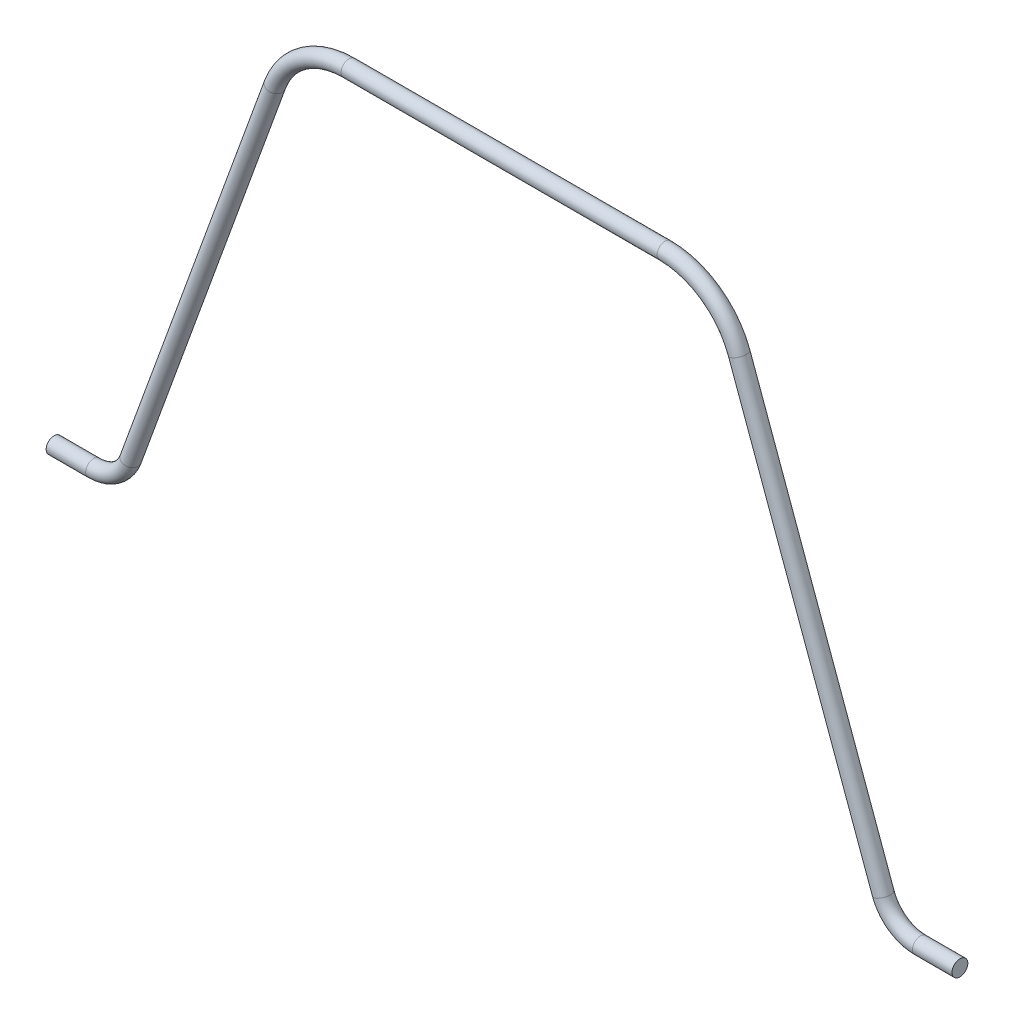
ISO-10303-21;
HEADER;
FILE_DESCRIPTION(('STEP AP214'),'2;1');
FILE_NAME('part.step','',(''),(''),'','','');
FILE_SCHEMA(('AUTOMOTIVE_DESIGN { 1 0 10303 214 1 1 1 1 }'));
ENDSEC;
DATA;
#1=APPLICATION_CONTEXT('core data for automotive mechanical design processes');
#2=APPLICATION_PROTOCOL_DEFINITION('international standard','automotive_design',2000,#1);
#3=PRODUCT_CONTEXT('',#1,'mechanical');
#4=PRODUCT('Part','Part','',(#3));
#5=PRODUCT_RELATED_PRODUCT_CATEGORY('part','',(#4));
#6=PRODUCT_DEFINITION_FORMATION('','',#4);
#7=PRODUCT_DEFINITION_CONTEXT('part definition',#1,'design');
#8=PRODUCT_DEFINITION('design','',#6,#7);
#9=PRODUCT_DEFINITION_SHAPE('','',#8);
#10=(LENGTH_UNIT() NAMED_UNIT(*) SI_UNIT(.MILLI.,.METRE.));
#11=(NAMED_UNIT(*) PLANE_ANGLE_UNIT() SI_UNIT($,.RADIAN.));
#12=(NAMED_UNIT(*) SI_UNIT($,.STERADIAN.) SOLID_ANGLE_UNIT());
#13=UNCERTAINTY_MEASURE_WITH_UNIT(LENGTH_MEASURE(1.E-05),#10,'distance_accuracy_value','');
#14=(GEOMETRIC_REPRESENTATION_CONTEXT(3) GLOBAL_UNCERTAINTY_ASSIGNED_CONTEXT((#13)) GLOBAL_UNIT_ASSIGNED_CONTEXT((#10,
#11,#12)) REPRESENTATION_CONTEXT('',''));
#15=CARTESIAN_POINT('',(0.,0.,0.));
#16=DIRECTION('',(0.,0.,1.));
#17=DIRECTION('',(1.,0.,0.));
#18=AXIS2_PLACEMENT_3D('',#15,#16,#17);
#19=CARTESIAN_POINT('',(-145.646970907959,-152.4,0.));
#20=DIRECTION('',(1.,0.,0.));
#21=DIRECTION('',(0.,0.,-1.));
#22=AXIS2_PLACEMENT_3D('',#19,#20,#21);
#23=PLANE('',#22);
#24=CARTESIAN_POINT('',(-145.646970907959,-152.4,0.));
#25=DIRECTION('',(1.,0.,0.));
#26=DIRECTION('',(0.,0.,-1.));
#27=AXIS2_PLACEMENT_3D('',#24,#25,#26);
#28=CIRCLE('',#27,2.54);
#29=CARTESIAN_POINT('',(-145.646970907959,-152.4,-2.54));
#30=VERTEX_POINT('',#29);
#31=EDGE_CURVE('E64',#30,#30,#28,.T.);
#32=ORIENTED_EDGE('',*,*,#31,.F.);
#33=EDGE_LOOP('',(#32));
#34=FACE_BOUND('',#33,.T.);
#35=ADVANCED_FACE('F30',(#34),#23,.F.);
#36=CARTESIAN_POINT('',(145.646970907959,-152.4,0.));
#37=DIRECTION('',(1.,0.,0.));
#38=DIRECTION('',(0.,0.,-1.));
#39=AXIS2_PLACEMENT_3D('',#36,#37,#38);
#40=PLANE('',#39);
#41=CARTESIAN_POINT('',(145.646970907959,-152.4,0.));
#42=DIRECTION('',(1.,0.,0.));
#43=DIRECTION('',(0.,0.,-1.));
#44=AXIS2_PLACEMENT_3D('',#41,#42,#43);
#45=CIRCLE('',#44,2.54);
#46=CARTESIAN_POINT('',(145.646970907959,-152.4,-2.54));
#47=VERTEX_POINT('',#46);
#48=EDGE_CURVE('E10',#47,#47,#45,.T.);
#49=ORIENTED_EDGE('',*,*,#48,.T.);
#50=EDGE_LOOP('',(#49));
#51=FACE_BOUND('',#50,.T.);
#52=ADVANCED_FACE('F71',(#51),#40,.T.);
#53=CARTESIAN_POINT('',(-145.646970907959,-152.4,0.));
#54=DIRECTION('',(1.,0.,0.));
#55=DIRECTION('',(0.,1.,0.));
#56=AXIS2_PLACEMENT_3D('',#53,#54,#55);
#57=CYLINDRICAL_SURFACE('',#56,2.54);
#58=CARTESIAN_POINT('',(-132.946970907959,-152.4,0.));
#59=DIRECTION('',(1.,0.,0.));
#60=DIRECTION('',(0.,0.,-1.));
#61=AXIS2_PLACEMENT_3D('',#58,#59,#60);
#62=CIRCLE('',#61,2.54);
#63=CARTESIAN_POINT('',(-132.946970907959,-154.94,0.));
#64=VERTEX_POINT('',#63);
#65=EDGE_CURVE('E61',#64,#64,#62,.T.);
#66=ORIENTED_EDGE('',*,*,#65,.F.);
#67=EDGE_LOOP('',(#66));
#68=FACE_BOUND('',#67,.T.);
#69=ORIENTED_EDGE('',*,*,#31,.T.);
#70=EDGE_LOOP('',(#69));
#71=FACE_BOUND('',#70,.T.);
#72=ADVANCED_FACE('F68',(#68,#71),#57,.T.);
#73=CARTESIAN_POINT('',(-132.946970907959,-139.7,0.));
#74=DIRECTION('',(0.,0.,1.));
#75=DIRECTION('',(1.,0.,0.));
#76=AXIS2_PLACEMENT_3D('',#73,#74,#75);
#77=TOROIDAL_SURFACE('',#76,12.7,2.54);
#78=CARTESIAN_POINT('',(-121.012874623978,-144.043655820236,0.));
#79=DIRECTION('',(0.342020143325666,0.939692620785909,0.));
#80=DIRECTION('',(0.,0.,-1.));
#81=AXIS2_PLACEMENT_3D('',#78,#79,#80);
#82=CIRCLE('',#81,2.54);
#83=CARTESIAN_POINT('',(-118.626055367182,-144.912386984283,0.));
#84=VERTEX_POINT('',#83);
#85=EDGE_CURVE('E58',#84,#84,#82,.T.);
#86=CARTESIAN_POINT('',(-132.946970907959,-139.7,0.));
#87=DIRECTION('',(0.,0.,1.));
#88=DIRECTION('',(1.,0.,0.));
#89=AXIS2_PLACEMENT_3D('',#86,#87,#88);
#90=CIRCLE('',#89,15.24);
#91=EDGE_CURVE('',#64,#84,#90,.T.);
#92=ORIENTED_EDGE('',*,*,#65,.T.);
#93=ORIENTED_EDGE('',*,*,#85,.F.);
#94=ORIENTED_EDGE('',*,*,#91,.T.);
#95=ORIENTED_EDGE('',*,*,#91,.F.);
#96=EDGE_LOOP('',(#92,#94,#93,#95));
#97=FACE_BOUND('',#96,.T.);
#98=ADVANCED_FACE('F105',(#97),#77,.T.);
#99=CARTESIAN_POINT('',(-121.012874623978,-144.043655820236,0.));
#100=DIRECTION('',(0.342020143325666,0.939692620785909,0.));
#101=DIRECTION('',(-0.939692620785909,0.342020143325666,0.));
#102=AXIS2_PLACEMENT_3D('',#99,#100,#101);
#103=CYLINDRICAL_SURFACE('',#102,2.54);
#104=CARTESIAN_POINT('',(-74.6681925679621,-16.7126883595281,0.));
#105=DIRECTION('',(0.342020143325666,0.939692620785909,0.));
#106=DIRECTION('',(0.,0.,-1.));
#107=AXIS2_PLACEMENT_3D('',#104,#105,#106);
#108=CIRCLE('',#107,2.54);
#109=CARTESIAN_POINT('',(-77.0550118247583,-15.8439571954809,0.));
#110=VERTEX_POINT('',#109);
#111=EDGE_CURVE('E55',#110,#110,#108,.T.);
#112=ORIENTED_EDGE('',*,*,#111,.F.);
#113=EDGE_LOOP('',(#112));
#114=FACE_BOUND('',#113,.T.);
#115=ORIENTED_EDGE('',*,*,#85,.T.);
#116=EDGE_LOOP('',(#115));
#117=FACE_BOUND('',#116,.T.);
#118=ADVANCED_FACE('F101',(#114,#117),#103,.T.);
#119=CARTESIAN_POINT('',(-50.8,-25.4,0.));
#120=DIRECTION('',(0.,0.,-1.));
#121=DIRECTION('',(-1.,0.,0.));
#122=AXIS2_PLACEMENT_3D('',#119,#120,#121);
#123=TOROIDAL_SURFACE('',#122,25.4,2.54);
#124=CARTESIAN_POINT('',(-50.8,0.,0.));
#125=DIRECTION('',(1.,0.,0.));
#126=DIRECTION('',(0.,0.,-1.));
#127=AXIS2_PLACEMENT_3D('',#124,#125,#126);
#128=CIRCLE('',#127,2.54);
#129=CARTESIAN_POINT('',(-50.8,2.54000000000001,0.));
#130=VERTEX_POINT('',#129);
#131=EDGE_CURVE('E52',#130,#130,#128,.T.);
#132=CARTESIAN_POINT('',(-50.8,-25.4,0.));
#133=DIRECTION('',(0.,0.,-1.));
#134=DIRECTION('',(-1.,0.,0.));
#135=AXIS2_PLACEMENT_3D('',#132,#133,#134);
#136=CIRCLE('',#135,27.94);
#137=EDGE_CURVE('',#110,#130,#136,.T.);
#138=ORIENTED_EDGE('',*,*,#111,.T.);
#139=ORIENTED_EDGE('',*,*,#131,.F.);
#140=ORIENTED_EDGE('',*,*,#137,.T.);
#141=ORIENTED_EDGE('',*,*,#137,.F.);
#142=EDGE_LOOP('',(#138,#140,#139,#141));
#143=FACE_BOUND('',#142,.T.);
#144=ADVANCED_FACE('F97',(#143),#123,.T.);
#145=CARTESIAN_POINT('',(-50.8,0.,0.));
#146=DIRECTION('',(1.,0.,0.));
#147=DIRECTION('',(0.,1.,0.));
#148=AXIS2_PLACEMENT_3D('',#145,#146,#147);
#149=CYLINDRICAL_SURFACE('',#148,2.54);
#150=CARTESIAN_POINT('',(50.8,0.,0.));
#151=DIRECTION('',(1.,0.,0.));
#152=DIRECTION('',(0.,0.,-1.));
#153=AXIS2_PLACEMENT_3D('',#150,#151,#152);
#154=CIRCLE('',#153,2.54);
#155=CARTESIAN_POINT('',(50.8,2.54,0.));
#156=VERTEX_POINT('',#155);
#157=EDGE_CURVE('E49',#156,#156,#154,.T.);
#158=ORIENTED_EDGE('',*,*,#157,.F.);
#159=EDGE_LOOP('',(#158));
#160=FACE_BOUND('',#159,.T.);
#161=ORIENTED_EDGE('',*,*,#131,.T.);
#162=EDGE_LOOP('',(#161));
#163=FACE_BOUND('',#162,.T.);
#164=ADVANCED_FACE('F93',(#160,#163),#149,.T.);
#165=CARTESIAN_POINT('',(50.8,-25.4,0.));
#166=DIRECTION('',(0.,0.,-1.));
#167=DIRECTION('',(-1.,0.,0.));
#168=AXIS2_PLACEMENT_3D('',#165,#166,#167);
#169=TOROIDAL_SURFACE('',#168,25.4,2.54);
#170=CARTESIAN_POINT('',(74.6681925679621,-16.7126883595281,0.));
#171=DIRECTION('',(0.342020143325666,-0.939692620785909,0.));
#172=DIRECTION('',(0.,0.,-1.));
#173=AXIS2_PLACEMENT_3D('',#170,#171,#172);
#174=CIRCLE('',#173,2.54);
#175=CARTESIAN_POINT('',(77.0550118247583,-15.8439571954809,0.));
#176=VERTEX_POINT('',#175);
#177=EDGE_CURVE('E44',#176,#176,#174,.T.);
#178=CARTESIAN_POINT('',(50.8,-25.4,0.));
#179=DIRECTION('',(0.,0.,-1.));
#180=DIRECTION('',(-1.,0.,0.));
#181=AXIS2_PLACEMENT_3D('',#178,#179,#180);
#182=CIRCLE('',#181,27.94);
#183=EDGE_CURVE('',#156,#176,#182,.T.);
#184=ORIENTED_EDGE('',*,*,#157,.T.);
#185=ORIENTED_EDGE('',*,*,#177,.F.);
#186=ORIENTED_EDGE('',*,*,#183,.T.);
#187=ORIENTED_EDGE('',*,*,#183,.F.);
#188=EDGE_LOOP('',(#184,#186,#185,#187));
#189=FACE_BOUND('',#188,.T.);
#190=ADVANCED_FACE('F89',(#189),#169,.T.);
#191=CARTESIAN_POINT('',(74.6681925679621,-16.7126883595281,0.));
#192=DIRECTION('',(0.342020143325666,-0.939692620785909,0.));
#193=DIRECTION('',(0.939692620785909,0.342020143325666,0.));
#194=AXIS2_PLACEMENT_3D('',#191,#192,#193);
#195=CYLINDRICAL_SURFACE('',#194,2.54);
#196=CARTESIAN_POINT('',(121.012874623978,-144.043655820236,0.));
#197=DIRECTION('',(0.342020143325666,-0.939692620785909,0.));
#198=DIRECTION('',(0.,0.,-1.));
#199=AXIS2_PLACEMENT_3D('',#196,#197,#198);
#200=CIRCLE('',#199,2.54);
#201=CARTESIAN_POINT('',(118.626055367182,-144.912386984283,0.));
#202=VERTEX_POINT('',#201);
#203=EDGE_CURVE('E40',#202,#202,#200,.T.);
#204=ORIENTED_EDGE('',*,*,#203,.F.);
#205=EDGE_LOOP('',(#204));
#206=FACE_BOUND('',#205,.T.);
#207=ORIENTED_EDGE('',*,*,#177,.T.);
#208=EDGE_LOOP('',(#207));
#209=FACE_BOUND('',#208,.T.);
#210=ADVANCED_FACE('F83',(#206,#209),#195,.T.);
#211=CARTESIAN_POINT('',(132.946970907959,-139.7,0.));
#212=DIRECTION('',(0.,0.,1.));
#213=DIRECTION('',(1.,0.,0.));
#214=AXIS2_PLACEMENT_3D('',#211,#212,#213);
#215=TOROIDAL_SURFACE('',#214,12.7,2.54);
#216=CARTESIAN_POINT('',(132.946970907959,-152.4,0.));
#217=DIRECTION('',(1.,0.,0.));
#218=DIRECTION('',(0.,0.,-1.));
#219=AXIS2_PLACEMENT_3D('',#216,#217,#218);
#220=CIRCLE('',#219,2.54);
#221=CARTESIAN_POINT('',(132.946970907959,-154.94,0.));
#222=VERTEX_POINT('',#221);
#223=EDGE_CURVE('E36',#222,#222,#220,.T.);
#224=CARTESIAN_POINT('',(132.946970907959,-139.7,0.));
#225=DIRECTION('',(0.,0.,1.));
#226=DIRECTION('',(1.,0.,0.));
#227=AXIS2_PLACEMENT_3D('',#224,#225,#226);
#228=CIRCLE('',#227,15.24);
#229=EDGE_CURVE('',#202,#222,#228,.T.);
#230=ORIENTED_EDGE('',*,*,#203,.T.);
#231=ORIENTED_EDGE('',*,*,#223,.F.);
#232=ORIENTED_EDGE('',*,*,#229,.T.);
#233=ORIENTED_EDGE('',*,*,#229,.F.);
#234=EDGE_LOOP('',(#230,#232,#231,#233));
#235=FACE_BOUND('',#234,.T.);
#236=ADVANCED_FACE('F77',(#235),#215,.T.);
#237=CARTESIAN_POINT('',(132.946970907959,-152.4,0.));
#238=DIRECTION('',(1.,0.,0.));
#239=DIRECTION('',(0.,1.,0.));
#240=AXIS2_PLACEMENT_3D('',#237,#238,#239);
#241=CYLINDRICAL_SURFACE('',#240,2.54);
#242=ORIENTED_EDGE('',*,*,#48,.F.);
#243=EDGE_LOOP('',(#242));
#244=FACE_BOUND('',#243,.T.);
#245=ORIENTED_EDGE('',*,*,#223,.T.);
#246=EDGE_LOOP('',(#245));
#247=FACE_BOUND('',#246,.T.);
#248=ADVANCED_FACE('F75',(#244,#247),#241,.T.);
#249=CLOSED_SHELL('',(#35,#52,#72,#98,#118,#144,#164,#190,#210,#236,#248));
#250=MANIFOLD_SOLID_BREP('B2',#249);
#251=ADVANCED_BREP_SHAPE_REPRESENTATION('',(#18,#250),#14);
#252=SHAPE_DEFINITION_REPRESENTATION(#9,#251);
ENDSEC;
END-ISO-10303-21;
